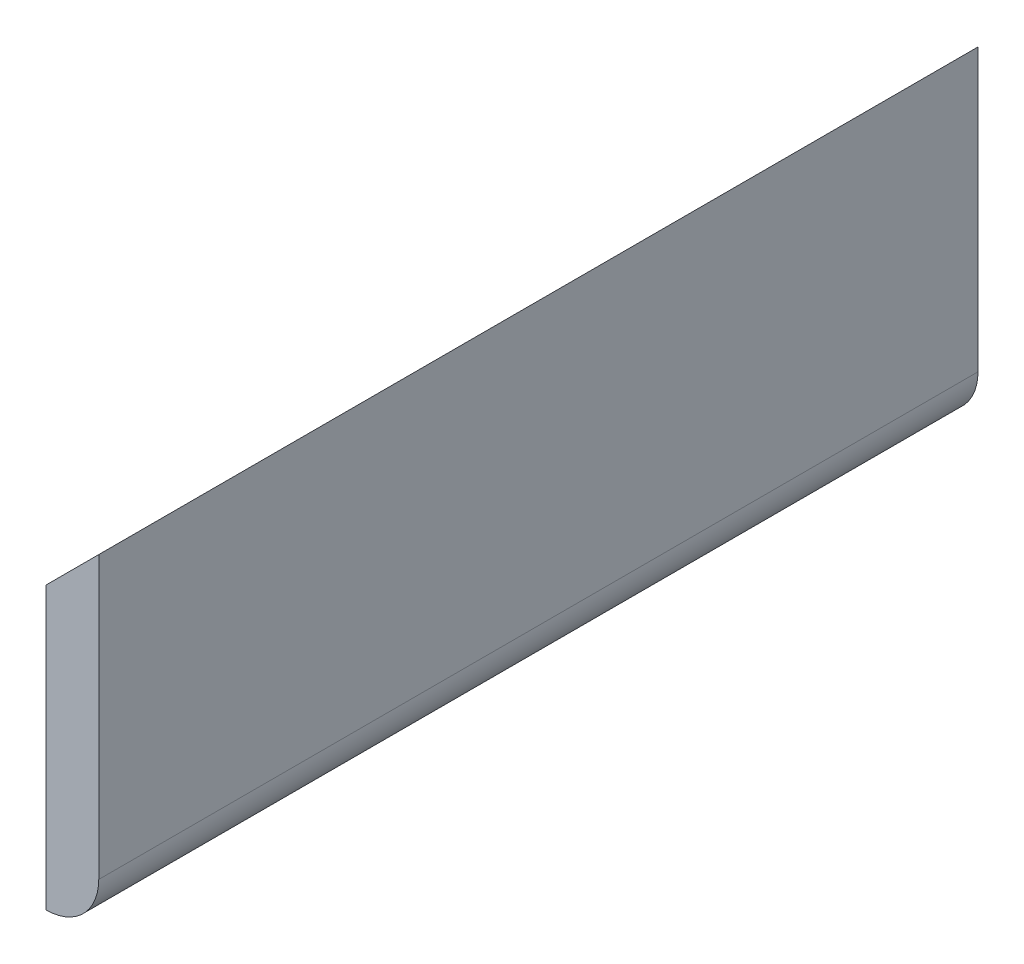
ISO-10303-21;
HEADER;
FILE_DESCRIPTION(('STEP AP214'),'2;1');
FILE_NAME('part.step','',(''),(''),'','','');
FILE_SCHEMA(('AUTOMOTIVE_DESIGN { 1 0 10303 214 1 1 1 1 }'));
ENDSEC;
DATA;
#1=APPLICATION_CONTEXT('core data for automotive mechanical design processes');
#2=APPLICATION_PROTOCOL_DEFINITION('international standard','automotive_design',2000,#1);
#3=PRODUCT_CONTEXT('',#1,'mechanical');
#4=PRODUCT('Part','Part','',(#3));
#5=PRODUCT_RELATED_PRODUCT_CATEGORY('part','',(#4));
#6=PRODUCT_DEFINITION_FORMATION('','',#4);
#7=PRODUCT_DEFINITION_CONTEXT('part definition',#1,'design');
#8=PRODUCT_DEFINITION('design','',#6,#7);
#9=PRODUCT_DEFINITION_SHAPE('','',#8);
#10=(LENGTH_UNIT() NAMED_UNIT(*) SI_UNIT(.MILLI.,.METRE.));
#11=(NAMED_UNIT(*) PLANE_ANGLE_UNIT() SI_UNIT($,.RADIAN.));
#12=(NAMED_UNIT(*) SI_UNIT($,.STERADIAN.) SOLID_ANGLE_UNIT());
#13=UNCERTAINTY_MEASURE_WITH_UNIT(LENGTH_MEASURE(1.E-05),#10,'distance_accuracy_value','');
#14=(GEOMETRIC_REPRESENTATION_CONTEXT(3) GLOBAL_UNCERTAINTY_ASSIGNED_CONTEXT((#13)) GLOBAL_UNIT_ASSIGNED_CONTEXT((#10,
#11,#12)) REPRESENTATION_CONTEXT('',''));
#15=CARTESIAN_POINT('',(0.,0.,0.));
#16=DIRECTION('',(0.,0.,1.));
#17=DIRECTION('',(1.,0.,0.));
#18=AXIS2_PLACEMENT_3D('',#15,#16,#17);
#19=CARTESIAN_POINT('',(2.5,-0.5,85.));
#20=DIRECTION('',(0.,0.,-1.));
#21=DIRECTION('',(-1.,0.,0.));
#22=AXIS2_PLACEMENT_3D('',#19,#20,#21);
#23=CYLINDRICAL_SURFACE('',#22,5.);
#24=CARTESIAN_POINT('',(2.5,-0.5,0.));
#25=DIRECTION('',(0.,0.,1.));
#26=DIRECTION('',(1.,0.,0.));
#27=AXIS2_PLACEMENT_3D('',#24,#25,#26);
#28=CIRCLE('',#27,5.);
#29=CARTESIAN_POINT('',(2.49999999999996,-5.5,0.));
#30=VERTEX_POINT('',#29);
#31=CARTESIAN_POINT('',(7.5,-0.499999999999965,0.));
#32=VERTEX_POINT('',#31);
#33=EDGE_CURVE('E362',#30,#32,#28,.T.);
#34=ORIENTED_EDGE('',*,*,#33,.T.);
#35=DIRECTION('',(0.,0.,-1.));
#36=VECTOR('',#35,1.);
#37=CARTESIAN_POINT('',(7.5,-0.499999999999965,85.));
#38=LINE('',#37,#36);
#39=CARTESIAN_POINT('',(7.5,-0.499999999999965,85.));
#40=VERTEX_POINT('',#39);
#41=EDGE_CURVE('E399',#40,#32,#38,.T.);
#42=ORIENTED_EDGE('',*,*,#41,.F.);
#43=CARTESIAN_POINT('',(2.5,-0.5,85.));
#44=DIRECTION('',(0.,0.,1.));
#45=DIRECTION('',(1.,0.,0.));
#46=AXIS2_PLACEMENT_3D('',#43,#44,#45);
#47=CIRCLE('',#46,5.);
#48=CARTESIAN_POINT('',(2.49999999999996,-5.5,85.));
#49=VERTEX_POINT('',#48);
#50=EDGE_CURVE('E363',#49,#40,#47,.T.);
#51=ORIENTED_EDGE('',*,*,#50,.F.);
#52=DIRECTION('',(0.,0.,-1.));
#53=VECTOR('',#52,1.);
#54=CARTESIAN_POINT('',(2.49999999999996,-5.5,85.));
#55=LINE('',#54,#53);
#56=EDGE_CURVE('E378',#49,#30,#55,.T.);
#57=ORIENTED_EDGE('',*,*,#56,.T.);
#58=EDGE_LOOP('',(#34,#42,#51,#57));
#59=FACE_BOUND('',#58,.T.);
#60=ADVANCED_FACE('F41',(#59),#23,.T.);
#61=CARTESIAN_POINT('',(-7.5,19.5,85.));
#62=DIRECTION('',(0.,1.,0.));
#63=DIRECTION('',(0.,0.,1.));
#64=AXIS2_PLACEMENT_3D('',#61,#62,#63);
#65=PLANE('',#64);
#66=DIRECTION('',(0.,0.,1.));
#67=VECTOR('',#66,1.);
#68=CARTESIAN_POINT('',(27.22,19.5,85.));
#69=LINE('',#68,#67);
#70=CARTESIAN_POINT('',(27.22,19.5,-80.5));
#71=VERTEX_POINT('',#70);
#72=CARTESIAN_POINT('',(27.22,19.5,165.5));
#73=VERTEX_POINT('',#72);
#74=EDGE_CURVE('E198',#71,#73,#69,.T.);
#75=ORIENTED_EDGE('',*,*,#74,.F.);
#76=DIRECTION('',(1.,0.,0.));
#77=VECTOR('',#76,1.);
#78=CARTESIAN_POINT('',(27.22,19.5,-80.5));
#79=LINE('',#78,#77);
#80=CARTESIAN_POINT('',(14.22,19.5,-80.5));
#81=VERTEX_POINT('',#80);
#82=EDGE_CURVE('E201',#81,#71,#79,.T.);
#83=ORIENTED_EDGE('',*,*,#82,.F.);
#84=DIRECTION('',(0.,0.,-1.));
#85=VECTOR('',#84,1.);
#86=CARTESIAN_POINT('',(14.22,19.5,0.));
#87=LINE('',#86,#85);
#88=CARTESIAN_POINT('',(14.22,19.5,0.));
#89=VERTEX_POINT('',#88);
#90=EDGE_CURVE('E241',#89,#81,#87,.T.);
#91=ORIENTED_EDGE('',*,*,#90,.F.);
#92=DIRECTION('',(1.,0.,0.));
#93=VECTOR('',#92,1.);
#94=CARTESIAN_POINT('',(-7.5,19.5,0.));
#95=LINE('',#94,#93);
#96=CARTESIAN_POINT('',(-7.5,19.5,0.));
#97=VERTEX_POINT('',#96);
#98=EDGE_CURVE('E381',#97,#89,#95,.T.);
#99=ORIENTED_EDGE('',*,*,#98,.F.);
#100=DIRECTION('',(0.,0.,-1.));
#101=VECTOR('',#100,1.);
#102=CARTESIAN_POINT('',(-7.5,19.5,85.));
#103=LINE('',#102,#101);
#104=CARTESIAN_POINT('',(-7.5,19.5,85.));
#105=VERTEX_POINT('',#104);
#106=EDGE_CURVE('E397',#105,#97,#103,.T.);
#107=ORIENTED_EDGE('',*,*,#106,.F.);
#108=DIRECTION('',(1.,0.,0.));
#109=VECTOR('',#108,1.);
#110=CARTESIAN_POINT('',(-7.5,19.5,85.));
#111=LINE('',#110,#109);
#112=CARTESIAN_POINT('',(14.22,19.5,85.));
#113=VERTEX_POINT('',#112);
#114=EDGE_CURVE('E366',#105,#113,#111,.T.);
#115=ORIENTED_EDGE('',*,*,#114,.T.);
#116=DIRECTION('',(0.,0.,-1.));
#117=VECTOR('',#116,1.);
#118=CARTESIAN_POINT('',(14.22,19.5,85.));
#119=LINE('',#118,#117);
#120=CARTESIAN_POINT('',(14.22,19.5,165.5));
#121=VERTEX_POINT('',#120);
#122=EDGE_CURVE('E231',#121,#113,#119,.T.);
#123=ORIENTED_EDGE('',*,*,#122,.F.);
#124=DIRECTION('',(-1.,0.,0.));
#125=VECTOR('',#124,1.);
#126=CARTESIAN_POINT('',(27.22,19.5,165.5));
#127=LINE('',#126,#125);
#128=EDGE_CURVE('E204',#73,#121,#127,.T.);
#129=ORIENTED_EDGE('',*,*,#128,.F.);
#130=EDGE_LOOP('',(#75,#83,#91,#99,#107,#115,#123,#129));
#131=FACE_BOUND('',#130,.T.);
#132=ADVANCED_FACE('F200',(#131),#65,.T.);
#133=CARTESIAN_POINT('',(-7.5,-0.499999999999964,85.));
#134=DIRECTION('',(-1.,0.,0.));
#135=DIRECTION('',(0.,-1.,0.));
#136=AXIS2_PLACEMENT_3D('',#133,#134,#135);
#137=PLANE('',#136);
#138=DIRECTION('',(0.,1.,0.));
#139=VECTOR('',#138,1.);
#140=CARTESIAN_POINT('',(-7.5,-0.499999999999964,0.));
#141=LINE('',#140,#139);
#142=CARTESIAN_POINT('',(-7.5,-0.499999999999964,0.));
#143=VERTEX_POINT('',#142);
#144=EDGE_CURVE('E384',#143,#97,#141,.T.);
#145=ORIENTED_EDGE('',*,*,#144,.F.);
#146=DIRECTION('',(0.,0.,-1.));
#147=VECTOR('',#146,1.);
#148=CARTESIAN_POINT('',(-7.5,-0.499999999999964,85.));
#149=LINE('',#148,#147);
#150=CARTESIAN_POINT('',(-7.5,-0.499999999999964,85.));
#151=VERTEX_POINT('',#150);
#152=EDGE_CURVE('E395',#151,#143,#149,.T.);
#153=ORIENTED_EDGE('',*,*,#152,.F.);
#154=DIRECTION('',(0.,1.,0.));
#155=VECTOR('',#154,1.);
#156=CARTESIAN_POINT('',(-7.5,-0.499999999999964,85.));
#157=LINE('',#156,#155);
#158=EDGE_CURVE('E370',#151,#105,#157,.T.);
#159=ORIENTED_EDGE('',*,*,#158,.T.);
#160=ORIENTED_EDGE('',*,*,#106,.T.);
#161=EDGE_LOOP('',(#145,#153,#159,#160));
#162=FACE_BOUND('',#161,.T.);
#163=ADVANCED_FACE('F435',(#162),#137,.T.);
#164=CARTESIAN_POINT('',(-2.5,-0.5,85.));
#165=DIRECTION('',(0.,0.,-1.));
#166=DIRECTION('',(-1.,0.,0.));
#167=AXIS2_PLACEMENT_3D('',#164,#165,#166);
#168=CYLINDRICAL_SURFACE('',#167,5.);
#169=CARTESIAN_POINT('',(-2.5,-0.5,0.));
#170=DIRECTION('',(0.,0.,-1.));
#171=DIRECTION('',(-1.,0.,0.));
#172=AXIS2_PLACEMENT_3D('',#169,#170,#171);
#173=CIRCLE('',#172,5.);
#174=CARTESIAN_POINT('',(-2.49999999999996,-5.5,0.));
#175=VERTEX_POINT('',#174);
#176=EDGE_CURVE('E387',#175,#143,#173,.T.);
#177=ORIENTED_EDGE('',*,*,#176,.F.);
#178=DIRECTION('',(0.,0.,-1.));
#179=VECTOR('',#178,1.);
#180=CARTESIAN_POINT('',(-2.49999999999996,-5.5,85.));
#181=LINE('',#180,#179);
#182=CARTESIAN_POINT('',(-2.49999999999996,-5.5,85.));
#183=VERTEX_POINT('',#182);
#184=EDGE_CURVE('E393',#183,#175,#181,.T.);
#185=ORIENTED_EDGE('',*,*,#184,.F.);
#186=CARTESIAN_POINT('',(-2.5,-0.5,85.));
#187=DIRECTION('',(0.,0.,-1.));
#188=DIRECTION('',(-1.,0.,0.));
#189=AXIS2_PLACEMENT_3D('',#186,#187,#188);
#190=CIRCLE('',#189,5.);
#191=EDGE_CURVE('E373',#183,#151,#190,.T.);
#192=ORIENTED_EDGE('',*,*,#191,.T.);
#193=ORIENTED_EDGE('',*,*,#152,.T.);
#194=EDGE_LOOP('',(#177,#185,#192,#193));
#195=FACE_BOUND('',#194,.T.);
#196=ADVANCED_FACE('F438',(#195),#168,.T.);
#197=CARTESIAN_POINT('',(-2.49999999999996,-5.5,85.));
#198=DIRECTION('',(0.,1.,0.));
#199=DIRECTION('',(0.,0.,1.));
#200=AXIS2_PLACEMENT_3D('',#197,#198,#199);
#201=PLANE('',#200);
#202=DIRECTION('',(1.,0.,0.));
#203=VECTOR('',#202,1.);
#204=CARTESIAN_POINT('',(-2.49999999999996,-5.5,0.));
#205=LINE('',#204,#203);
#206=EDGE_CURVE('E367',#175,#30,#205,.T.);
#207=ORIENTED_EDGE('',*,*,#206,.T.);
#208=ORIENTED_EDGE('',*,*,#56,.F.);
#209=DIRECTION('',(1.,0.,0.));
#210=VECTOR('',#209,1.);
#211=CARTESIAN_POINT('',(-2.49999999999996,-5.5,85.));
#212=LINE('',#211,#210);
#213=EDGE_CURVE('E376',#183,#49,#212,.T.);
#214=ORIENTED_EDGE('',*,*,#213,.F.);
#215=ORIENTED_EDGE('',*,*,#184,.T.);
#216=EDGE_LOOP('',(#207,#208,#214,#215));
#217=FACE_BOUND('',#216,.T.);
#218=ADVANCED_FACE('F442',(#217),#201,.F.);
#219=CARTESIAN_POINT('',(2.5,-0.5,85.));
#220=DIRECTION('',(0.,0.,1.));
#221=DIRECTION('',(1.,0.,0.));
#222=AXIS2_PLACEMENT_3D('',#219,#220,#221);
#223=PLANE('',#222);
#224=DIRECTION('',(0.,1.,0.));
#225=VECTOR('',#224,1.);
#226=CARTESIAN_POINT('',(14.22,-0.499999999999997,85.));
#227=LINE('',#226,#225);
#228=CARTESIAN_POINT('',(14.22,-0.499999999999966,85.));
#229=VERTEX_POINT('',#228);
#230=EDGE_CURVE('E210',#229,#113,#227,.T.);
#231=ORIENTED_EDGE('',*,*,#230,.T.);
#232=ORIENTED_EDGE('',*,*,#114,.F.);
#233=ORIENTED_EDGE('',*,*,#158,.F.);
#234=ORIENTED_EDGE('',*,*,#191,.F.);
#235=ORIENTED_EDGE('',*,*,#213,.T.);
#236=ORIENTED_EDGE('',*,*,#50,.T.);
#237=DIRECTION('',(-1.,0.,0.));
#238=VECTOR('',#237,1.);
#239=CARTESIAN_POINT('',(29.22,-0.499999999999968,85.));
#240=LINE('',#239,#238);
#241=EDGE_CURVE('E209',#229,#40,#240,.T.);
#242=ORIENTED_EDGE('',*,*,#241,.F.);
#243=EDGE_LOOP('',(#231,#232,#233,#234,#235,#236,#242));
#244=FACE_BOUND('',#243,.T.);
#245=CARTESIAN_POINT('',(0.,0.,85.));
#246=DIRECTION('',(0.,0.,1.));
#247=DIRECTION('',(1.,0.,0.));
#248=AXIS2_PLACEMENT_3D('',#245,#246,#247);
#249=CIRCLE('',#248,4.);
#250=CARTESIAN_POINT('',(-1.,3.87298334620742,85.));
#251=VERTEX_POINT('',#250);
#252=CARTESIAN_POINT('',(1.,3.87298334620742,85.));
#253=VERTEX_POINT('',#252);
#254=EDGE_CURVE('E291',#251,#253,#249,.T.);
#255=ORIENTED_EDGE('',*,*,#254,.F.);
#256=DIRECTION('',(0.,-1.,0.));
#257=VECTOR('',#256,1.);
#258=CARTESIAN_POINT('',(-1.,3.87298334620742,85.));
#259=LINE('',#258,#257);
#260=CARTESIAN_POINT('',(-1.,16.,85.));
#261=VERTEX_POINT('',#260);
#262=EDGE_CURVE('E309',#261,#251,#259,.T.);
#263=ORIENTED_EDGE('',*,*,#262,.F.);
#264=DIRECTION('',(-1.,0.,0.));
#265=VECTOR('',#264,1.);
#266=CARTESIAN_POINT('',(-1.,16.,85.));
#267=LINE('',#266,#265);
#268=CARTESIAN_POINT('',(1.,16.,85.));
#269=VERTEX_POINT('',#268);
#270=EDGE_CURVE('E312',#269,#261,#267,.T.);
#271=ORIENTED_EDGE('',*,*,#270,.F.);
#272=DIRECTION('',(0.,1.,0.));
#273=VECTOR('',#272,1.);
#274=CARTESIAN_POINT('',(1.,3.87298334620742,85.));
#275=LINE('',#274,#273);
#276=EDGE_CURVE('E298',#253,#269,#275,.T.);
#277=ORIENTED_EDGE('',*,*,#276,.F.);
#278=EDGE_LOOP('',(#255,#263,#271,#277));
#279=FACE_BOUND('',#278,.T.);
#280=ADVANCED_FACE('F415',(#244,#279),#223,.T.);
#281=CARTESIAN_POINT('',(0.,0.,0.));
#282=DIRECTION('',(0.,0.,1.));
#283=DIRECTION('',(1.,0.,0.));
#284=AXIS2_PLACEMENT_3D('',#281,#282,#283);
#285=PLANE('',#284);
#286=CARTESIAN_POINT('',(0.,0.,0.));
#287=DIRECTION('',(0.,0.,1.));
#288=DIRECTION('',(1.,0.,0.));
#289=AXIS2_PLACEMENT_3D('',#286,#287,#288);
#290=CIRCLE('',#289,4.);
#291=CARTESIAN_POINT('',(-1.,3.87298334620742,0.));
#292=VERTEX_POINT('',#291);
#293=CARTESIAN_POINT('',(1.,3.87298334620742,0.));
#294=VERTEX_POINT('',#293);
#295=EDGE_CURVE('E329',#292,#294,#290,.T.);
#296=ORIENTED_EDGE('',*,*,#295,.T.);
#297=DIRECTION('',(0.,1.,0.));
#298=VECTOR('',#297,1.);
#299=CARTESIAN_POINT('',(1.,3.87298334620742,0.));
#300=LINE('',#299,#298);
#301=CARTESIAN_POINT('',(1.,16.,0.));
#302=VERTEX_POINT('',#301);
#303=EDGE_CURVE('E345',#294,#302,#300,.T.);
#304=ORIENTED_EDGE('',*,*,#303,.T.);
#305=DIRECTION('',(-1.,0.,0.));
#306=VECTOR('',#305,1.);
#307=CARTESIAN_POINT('',(-1.,16.,0.));
#308=LINE('',#307,#306);
#309=CARTESIAN_POINT('',(-1.,16.,0.));
#310=VERTEX_POINT('',#309);
#311=EDGE_CURVE('E348',#302,#310,#308,.T.);
#312=ORIENTED_EDGE('',*,*,#311,.T.);
#313=DIRECTION('',(0.,-1.,0.));
#314=VECTOR('',#313,1.);
#315=CARTESIAN_POINT('',(-1.,3.87298334620742,0.));
#316=LINE('',#315,#314);
#317=EDGE_CURVE('E336',#310,#292,#316,.T.);
#318=ORIENTED_EDGE('',*,*,#317,.T.);
#319=EDGE_LOOP('',(#296,#304,#312,#318));
#320=FACE_BOUND('',#319,.T.);
#321=ORIENTED_EDGE('',*,*,#98,.T.);
#322=DIRECTION('',(0.,1.,0.));
#323=VECTOR('',#322,1.);
#324=CARTESIAN_POINT('',(14.22,-0.499999999999997,0.));
#325=LINE('',#324,#323);
#326=CARTESIAN_POINT('',(14.22,-0.499999999999997,0.));
#327=VERTEX_POINT('',#326);
#328=EDGE_CURVE('E276',#327,#89,#325,.T.);
#329=ORIENTED_EDGE('',*,*,#328,.F.);
#330=DIRECTION('',(-1.,0.,0.));
#331=VECTOR('',#330,1.);
#332=CARTESIAN_POINT('',(29.22,-0.499999999999968,0.));
#333=LINE('',#332,#331);
#334=EDGE_CURVE('E285',#327,#32,#333,.T.);
#335=ORIENTED_EDGE('',*,*,#334,.T.);
#336=ORIENTED_EDGE('',*,*,#33,.F.);
#337=ORIENTED_EDGE('',*,*,#206,.F.);
#338=ORIENTED_EDGE('',*,*,#176,.T.);
#339=ORIENTED_EDGE('',*,*,#144,.T.);
#340=EDGE_LOOP('',(#321,#329,#335,#336,#337,#338,#339));
#341=FACE_BOUND('',#340,.T.);
#342=ADVANCED_FACE('F428',(#320,#341),#285,.F.);
#343=CARTESIAN_POINT('',(0.,0.,5.));
#344=DIRECTION('',(0.,0.,1.));
#345=DIRECTION('',(1.,0.,0.));
#346=AXIS2_PLACEMENT_3D('',#343,#344,#345);
#347=PLANE('',#346);
#348=CARTESIAN_POINT('',(0.,0.,5.));
#349=DIRECTION('',(0.,0.,1.));
#350=DIRECTION('',(1.,0.,0.));
#351=AXIS2_PLACEMENT_3D('',#348,#349,#350);
#352=CIRCLE('',#351,4.);
#353=CARTESIAN_POINT('',(-1.,3.87298334620742,5.));
#354=VERTEX_POINT('',#353);
#355=CARTESIAN_POINT('',(1.,3.87298334620742,5.));
#356=VERTEX_POINT('',#355);
#357=EDGE_CURVE('E332',#354,#356,#352,.T.);
#358=ORIENTED_EDGE('',*,*,#357,.F.);
#359=DIRECTION('',(0.,-1.,0.));
#360=VECTOR('',#359,1.);
#361=CARTESIAN_POINT('',(-1.,3.87298334620742,5.));
#362=LINE('',#361,#360);
#363=CARTESIAN_POINT('',(-1.,16.,5.));
#364=VERTEX_POINT('',#363);
#365=EDGE_CURVE('E340',#364,#354,#362,.T.);
#366=ORIENTED_EDGE('',*,*,#365,.F.);
#367=DIRECTION('',(-1.,0.,0.));
#368=VECTOR('',#367,1.);
#369=CARTESIAN_POINT('',(-1.,16.,5.));
#370=LINE('',#369,#368);
#371=CARTESIAN_POINT('',(1.,16.,5.));
#372=VERTEX_POINT('',#371);
#373=EDGE_CURVE('E338',#372,#364,#370,.T.);
#374=ORIENTED_EDGE('',*,*,#373,.F.);
#375=DIRECTION('',(0.,1.,0.));
#376=VECTOR('',#375,1.);
#377=CARTESIAN_POINT('',(1.,3.87298334620742,5.));
#378=LINE('',#377,#376);
#379=EDGE_CURVE('E335',#356,#372,#378,.T.);
#380=ORIENTED_EDGE('',*,*,#379,.F.);
#381=EDGE_LOOP('',(#358,#366,#374,#380));
#382=FACE_BOUND('',#381,.T.);
#383=CARTESIAN_POINT('',(0.,0.,5.));
#384=DIRECTION('',(0.,0.,1.));
#385=DIRECTION('',(1.,0.,0.));
#386=AXIS2_PLACEMENT_3D('',#383,#384,#385);
#387=CIRCLE('',#386,2.25);
#388=CARTESIAN_POINT('',(2.25,0.,5.));
#389=VERTEX_POINT('',#388);
#390=EDGE_CURVE('E326',#389,#389,#387,.T.);
#391=ORIENTED_EDGE('',*,*,#390,.T.);
#392=EDGE_LOOP('',(#391));
#393=FACE_BOUND('',#392,.T.);
#394=ADVANCED_FACE('F456',(#382,#393),#347,.F.);
#395=CARTESIAN_POINT('',(0.,0.,5.));
#396=DIRECTION('',(0.,0.,-1.));
#397=DIRECTION('',(-1.,0.,0.));
#398=AXIS2_PLACEMENT_3D('',#395,#396,#397);
#399=CYLINDRICAL_SURFACE('',#398,4.);
#400=ORIENTED_EDGE('',*,*,#295,.F.);
#401=DIRECTION('',(0.,0.,-1.));
#402=VECTOR('',#401,1.);
#403=CARTESIAN_POINT('',(-1.,3.87298334620742,5.));
#404=LINE('',#403,#402);
#405=EDGE_CURVE('E342',#354,#292,#404,.T.);
#406=ORIENTED_EDGE('',*,*,#405,.F.);
#407=ORIENTED_EDGE('',*,*,#357,.T.);
#408=DIRECTION('',(0.,0.,-1.));
#409=VECTOR('',#408,1.);
#410=CARTESIAN_POINT('',(1.,3.87298334620742,5.));
#411=LINE('',#410,#409);
#412=EDGE_CURVE('E359',#356,#294,#411,.T.);
#413=ORIENTED_EDGE('',*,*,#412,.T.);
#414=EDGE_LOOP('',(#400,#406,#407,#413));
#415=FACE_BOUND('',#414,.T.);
#416=ADVANCED_FACE('F511',(#415),#399,.F.);
#417=CARTESIAN_POINT('',(1.,3.87298334620742,5.));
#418=DIRECTION('',(-1.,0.,0.));
#419=DIRECTION('',(0.,-1.,0.));
#420=AXIS2_PLACEMENT_3D('',#417,#418,#419);
#421=PLANE('',#420);
#422=ORIENTED_EDGE('',*,*,#303,.F.);
#423=ORIENTED_EDGE('',*,*,#412,.F.);
#424=ORIENTED_EDGE('',*,*,#379,.T.);
#425=DIRECTION('',(0.,0.,-1.));
#426=VECTOR('',#425,1.);
#427=CARTESIAN_POINT('',(1.,16.,5.));
#428=LINE('',#427,#426);
#429=EDGE_CURVE('E357',#372,#302,#428,.T.);
#430=ORIENTED_EDGE('',*,*,#429,.T.);
#431=EDGE_LOOP('',(#422,#423,#424,#430));
#432=FACE_BOUND('',#431,.T.);
#433=ADVANCED_FACE('F519',(#432),#421,.T.);
#434=CARTESIAN_POINT('',(-1.,16.,5.));
#435=DIRECTION('',(0.,-1.,0.));
#436=DIRECTION('',(0.,0.,-1.));
#437=AXIS2_PLACEMENT_3D('',#434,#435,#436);
#438=PLANE('',#437);
#439=ORIENTED_EDGE('',*,*,#311,.F.);
#440=ORIENTED_EDGE('',*,*,#429,.F.);
#441=ORIENTED_EDGE('',*,*,#373,.T.);
#442=DIRECTION('',(0.,0.,-1.));
#443=VECTOR('',#442,1.);
#444=CARTESIAN_POINT('',(-1.,16.,5.));
#445=LINE('',#444,#443);
#446=EDGE_CURVE('E355',#364,#310,#445,.T.);
#447=ORIENTED_EDGE('',*,*,#446,.T.);
#448=EDGE_LOOP('',(#439,#440,#441,#447));
#449=FACE_BOUND('',#448,.T.);
#450=ADVANCED_FACE('F515',(#449),#438,.T.);
#451=CARTESIAN_POINT('',(-1.,3.87298334620742,5.));
#452=DIRECTION('',(1.,0.,0.));
#453=DIRECTION('',(0.,1.,0.));
#454=AXIS2_PLACEMENT_3D('',#451,#452,#453);
#455=PLANE('',#454);
#456=ORIENTED_EDGE('',*,*,#317,.F.);
#457=ORIENTED_EDGE('',*,*,#446,.F.);
#458=ORIENTED_EDGE('',*,*,#365,.T.);
#459=ORIENTED_EDGE('',*,*,#405,.T.);
#460=EDGE_LOOP('',(#456,#457,#458,#459));
#461=FACE_BOUND('',#460,.T.);
#462=ADVANCED_FACE('F507',(#461),#455,.T.);
#463=CARTESIAN_POINT('',(0.,0.,5.));
#464=DIRECTION('',(0.,0.,-1.));
#465=DIRECTION('',(-1.,0.,0.));
#466=AXIS2_PLACEMENT_3D('',#463,#464,#465);
#467=CYLINDRICAL_SURFACE('',#466,2.25);
#468=ORIENTED_EDGE('',*,*,#390,.F.);
#469=EDGE_LOOP('',(#468));
#470=FACE_BOUND('',#469,.T.);
#471=CARTESIAN_POINT('',(0.,0.,0.));
#472=DIRECTION('',(0.,0.,1.));
#473=DIRECTION('',(1.,0.,0.));
#474=AXIS2_PLACEMENT_3D('',#471,#472,#473);
#475=CIRCLE('',#474,2.25);
#476=CARTESIAN_POINT('',(2.25,0.,0.));
#477=VERTEX_POINT('',#476);
#478=EDGE_CURVE('E325',#477,#477,#475,.T.);
#479=ORIENTED_EDGE('',*,*,#478,.T.);
#480=EDGE_LOOP('',(#479));
#481=FACE_BOUND('',#480,.T.);
#482=ADVANCED_FACE('F504',(#470,#481),#467,.T.);
#483=ORIENTED_EDGE('',*,*,#478,.F.);
#484=EDGE_LOOP('',(#483));
#485=FACE_BOUND('',#484,.T.);
#486=ADVANCED_FACE('F458',(#485),#285,.F.);
#487=CARTESIAN_POINT('',(0.,0.,80.));
#488=DIRECTION('',(0.,0.,1.));
#489=DIRECTION('',(1.,0.,0.));
#490=AXIS2_PLACEMENT_3D('',#487,#488,#489);
#491=CYLINDRICAL_SURFACE('',#490,4.);
#492=ORIENTED_EDGE('',*,*,#254,.T.);
#493=DIRECTION('',(0.,0.,1.));
#494=VECTOR('',#493,1.);
#495=CARTESIAN_POINT('',(1.,3.87298334620742,80.));
#496=LINE('',#495,#494);
#497=CARTESIAN_POINT('',(1.,3.87298334620742,80.));
#498=VERTEX_POINT('',#497);
#499=EDGE_CURVE('E307',#498,#253,#496,.T.);
#500=ORIENTED_EDGE('',*,*,#499,.F.);
#501=CARTESIAN_POINT('',(0.,0.,80.));
#502=DIRECTION('',(0.,0.,1.));
#503=DIRECTION('',(1.,0.,0.));
#504=AXIS2_PLACEMENT_3D('',#501,#502,#503);
#505=CIRCLE('',#504,4.);
#506=CARTESIAN_POINT('',(-1.,3.87298334620742,80.));
#507=VERTEX_POINT('',#506);
#508=EDGE_CURVE('E294',#507,#498,#505,.T.);
#509=ORIENTED_EDGE('',*,*,#508,.F.);
#510=DIRECTION('',(0.,0.,1.));
#511=VECTOR('',#510,1.);
#512=CARTESIAN_POINT('',(-1.,3.87298334620742,80.));
#513=LINE('',#512,#511);
#514=EDGE_CURVE('E323',#507,#251,#513,.T.);
#515=ORIENTED_EDGE('',*,*,#514,.T.);
#516=EDGE_LOOP('',(#492,#500,#509,#515));
#517=FACE_BOUND('',#516,.T.);
#518=ADVANCED_FACE('F499',(#517),#491,.F.);
#519=CARTESIAN_POINT('',(-1.,3.87298334620742,80.));
#520=DIRECTION('',(-1.,0.,0.));
#521=DIRECTION('',(0.,-1.,0.));
#522=AXIS2_PLACEMENT_3D('',#519,#520,#521);
#523=PLANE('',#522);
#524=ORIENTED_EDGE('',*,*,#262,.T.);
#525=ORIENTED_EDGE('',*,*,#514,.F.);
#526=DIRECTION('',(0.,-1.,0.));
#527=VECTOR('',#526,1.);
#528=CARTESIAN_POINT('',(-1.,3.87298334620742,80.));
#529=LINE('',#528,#527);
#530=CARTESIAN_POINT('',(-1.,16.,80.));
#531=VERTEX_POINT('',#530);
#532=EDGE_CURVE('E297',#531,#507,#529,.T.);
#533=ORIENTED_EDGE('',*,*,#532,.F.);
#534=DIRECTION('',(0.,0.,1.));
#535=VECTOR('',#534,1.);
#536=CARTESIAN_POINT('',(-1.,16.,80.));
#537=LINE('',#536,#535);
#538=EDGE_CURVE('E321',#531,#261,#537,.T.);
#539=ORIENTED_EDGE('',*,*,#538,.T.);
#540=EDGE_LOOP('',(#524,#525,#533,#539));
#541=FACE_BOUND('',#540,.T.);
#542=ADVANCED_FACE('F495',(#541),#523,.F.);
#543=CARTESIAN_POINT('',(-1.,16.,80.));
#544=DIRECTION('',(0.,1.,0.));
#545=DIRECTION('',(0.,0.,1.));
#546=AXIS2_PLACEMENT_3D('',#543,#544,#545);
#547=PLANE('',#546);
#548=ORIENTED_EDGE('',*,*,#270,.T.);
#549=ORIENTED_EDGE('',*,*,#538,.F.);
#550=DIRECTION('',(-1.,0.,0.));
#551=VECTOR('',#550,1.);
#552=CARTESIAN_POINT('',(-1.,16.,80.));
#553=LINE('',#552,#551);
#554=CARTESIAN_POINT('',(1.,16.,80.));
#555=VERTEX_POINT('',#554);
#556=EDGE_CURVE('E301',#555,#531,#553,.T.);
#557=ORIENTED_EDGE('',*,*,#556,.F.);
#558=DIRECTION('',(0.,0.,1.));
#559=VECTOR('',#558,1.);
#560=CARTESIAN_POINT('',(1.,16.,80.));
#561=LINE('',#560,#559);
#562=EDGE_CURVE('E319',#555,#269,#561,.T.);
#563=ORIENTED_EDGE('',*,*,#562,.T.);
#564=EDGE_LOOP('',(#548,#549,#557,#563));
#565=FACE_BOUND('',#564,.T.);
#566=ADVANCED_FACE('F491',(#565),#547,.F.);
#567=CARTESIAN_POINT('',(1.,3.87298334620742,80.));
#568=DIRECTION('',(1.,0.,0.));
#569=DIRECTION('',(0.,1.,0.));
#570=AXIS2_PLACEMENT_3D('',#567,#568,#569);
#571=PLANE('',#570);
#572=ORIENTED_EDGE('',*,*,#276,.T.);
#573=ORIENTED_EDGE('',*,*,#562,.F.);
#574=DIRECTION('',(0.,1.,0.));
#575=VECTOR('',#574,1.);
#576=CARTESIAN_POINT('',(1.,3.87298334620742,80.));
#577=LINE('',#576,#575);
#578=EDGE_CURVE('E304',#498,#555,#577,.T.);
#579=ORIENTED_EDGE('',*,*,#578,.F.);
#580=ORIENTED_EDGE('',*,*,#499,.T.);
#581=EDGE_LOOP('',(#572,#573,#579,#580));
#582=FACE_BOUND('',#581,.T.);
#583=ADVANCED_FACE('F487',(#582),#571,.F.);
#584=CARTESIAN_POINT('',(0.,0.,80.));
#585=DIRECTION('',(0.,0.,-1.));
#586=DIRECTION('',(1.,0.,0.));
#587=AXIS2_PLACEMENT_3D('',#584,#585,#586);
#588=PLANE('',#587);
#589=CARTESIAN_POINT('',(0.,0.,80.));
#590=DIRECTION('',(0.,0.,1.));
#591=DIRECTION('',(1.,0.,0.));
#592=AXIS2_PLACEMENT_3D('',#589,#590,#591);
#593=CIRCLE('',#592,2.25);
#594=CARTESIAN_POINT('',(2.25,0.,80.));
#595=VERTEX_POINT('',#594);
#596=EDGE_CURVE('E288',#595,#595,#593,.T.);
#597=ORIENTED_EDGE('',*,*,#596,.F.);
#598=EDGE_LOOP('',(#597));
#599=FACE_BOUND('',#598,.T.);
#600=ORIENTED_EDGE('',*,*,#508,.T.);
#601=ORIENTED_EDGE('',*,*,#578,.T.);
#602=ORIENTED_EDGE('',*,*,#556,.T.);
#603=ORIENTED_EDGE('',*,*,#532,.T.);
#604=EDGE_LOOP('',(#600,#601,#602,#603));
#605=FACE_BOUND('',#604,.T.);
#606=ADVANCED_FACE('F483',(#599,#605),#588,.F.);
#607=CARTESIAN_POINT('',(0.,0.,80.));
#608=DIRECTION('',(0.,0.,1.));
#609=DIRECTION('',(1.,0.,0.));
#610=AXIS2_PLACEMENT_3D('',#607,#608,#609);
#611=CYLINDRICAL_SURFACE('',#610,2.25);
#612=ORIENTED_EDGE('',*,*,#596,.T.);
#613=EDGE_LOOP('',(#612));
#614=FACE_BOUND('',#613,.T.);
#615=CARTESIAN_POINT('',(0.,0.,85.));
#616=DIRECTION('',(0.,0.,1.));
#617=DIRECTION('',(1.,0.,0.));
#618=AXIS2_PLACEMENT_3D('',#615,#616,#617);
#619=CIRCLE('',#618,2.25);
#620=CARTESIAN_POINT('',(2.25,0.,85.));
#621=VERTEX_POINT('',#620);
#622=EDGE_CURVE('E287',#621,#621,#619,.T.);
#623=ORIENTED_EDGE('',*,*,#622,.F.);
#624=EDGE_LOOP('',(#623));
#625=FACE_BOUND('',#624,.T.);
#626=ADVANCED_FACE('F480',(#614,#625),#611,.T.);
#627=ORIENTED_EDGE('',*,*,#622,.T.);
#628=EDGE_LOOP('',(#627));
#629=FACE_BOUND('',#628,.T.);
#630=ADVANCED_FACE('F479',(#629),#223,.T.);
#631=CARTESIAN_POINT('',(29.22,-0.499999999999968,85.));
#632=DIRECTION('',(0.,1.,0.));
#633=DIRECTION('',(-1.,0.,0.));
#634=AXIS2_PLACEMENT_3D('',#631,#632,#633);
#635=PLANE('',#634);
#636=ORIENTED_EDGE('',*,*,#334,.F.);
#637=DIRECTION('',(0.,0.,-1.));
#638=VECTOR('',#637,1.);
#639=CARTESIAN_POINT('',(14.22,-0.499999999999966,167.5));
#640=LINE('',#639,#638);
#641=EDGE_CURVE('E248',#327,#229,#640,.F.);
#642=ORIENTED_EDGE('',*,*,#641,.T.);
#643=ORIENTED_EDGE('',*,*,#241,.T.);
#644=ORIENTED_EDGE('',*,*,#41,.T.);
#645=EDGE_LOOP('',(#636,#642,#643,#644));
#646=FACE_BOUND('',#645,.T.);
#647=ADVANCED_FACE('F407',(#646),#635,.F.);
#648=CARTESIAN_POINT('',(29.22,0.,0.));
#649=DIRECTION('',(1.,0.,0.));
#650=DIRECTION('',(0.,1.,0.));
#651=AXIS2_PLACEMENT_3D('',#648,#649,#650);
#652=PLANE('',#651);
#653=DIRECTION('',(0.,1.,0.));
#654=VECTOR('',#653,1.);
#655=CARTESIAN_POINT('',(29.22,-0.499999999999997,167.5));
#656=LINE('',#655,#654);
#657=CARTESIAN_POINT('',(29.22,14.5,167.5));
#658=VERTEX_POINT('',#657);
#659=CARTESIAN_POINT('',(29.22,94.5,167.5));
#660=VERTEX_POINT('',#659);
#661=EDGE_CURVE('E274',#658,#660,#656,.T.);
#662=ORIENTED_EDGE('',*,*,#661,.F.);
#663=DIRECTION('',(0.,0.,-1.));
#664=VECTOR('',#663,1.);
#665=CARTESIAN_POINT('',(29.22,14.5,-82.5));
#666=LINE('',#665,#664);
#667=CARTESIAN_POINT('',(29.22,14.5,-82.5));
#668=VERTEX_POINT('',#667);
#669=EDGE_CURVE('E273',#658,#668,#666,.T.);
#670=ORIENTED_EDGE('',*,*,#669,.T.);
#671=DIRECTION('',(0.,1.,0.));
#672=VECTOR('',#671,1.);
#673=CARTESIAN_POINT('',(29.22,-0.499999999999997,-82.5));
#674=LINE('',#673,#672);
#675=CARTESIAN_POINT('',(29.22,94.5,-82.5));
#676=VERTEX_POINT('',#675);
#677=EDGE_CURVE('E262',#668,#676,#674,.T.);
#678=ORIENTED_EDGE('',*,*,#677,.T.);
#679=DIRECTION('',(0.,0.,-1.));
#680=VECTOR('',#679,1.);
#681=CARTESIAN_POINT('',(29.22,94.5,167.5));
#682=LINE('',#681,#680);
#683=EDGE_CURVE('E233',#660,#676,#682,.T.);
#684=ORIENTED_EDGE('',*,*,#683,.F.);
#685=EDGE_LOOP('',(#662,#670,#678,#684));
#686=FACE_BOUND('',#685,.T.);
#687=ADVANCED_FACE('F271',(#686),#652,.T.);
#688=CARTESIAN_POINT('',(14.22,-0.499999999999997,85.));
#689=DIRECTION('',(-1.,0.,0.));
#690=DIRECTION('',(0.,0.,1.));
#691=AXIS2_PLACEMENT_3D('',#688,#689,#690);
#692=PLANE('',#691);
#693=DIRECTION('',(0.,1.,0.));
#694=VECTOR('',#693,1.);
#695=CARTESIAN_POINT('',(14.22,-0.499999999999997,167.5));
#696=LINE('',#695,#694);
#697=CARTESIAN_POINT('',(14.22,-0.499999999999997,167.5));
#698=VERTEX_POINT('',#697);
#699=CARTESIAN_POINT('',(14.22,79.4999999999999,167.5));
#700=VERTEX_POINT('',#699);
#701=EDGE_CURVE('E278',#698,#700,#696,.T.);
#702=ORIENTED_EDGE('',*,*,#701,.T.);
#703=DIRECTION('',(0.,0.,-1.));
#704=VECTOR('',#703,1.);
#705=CARTESIAN_POINT('',(14.22,79.4999999999999,165.5));
#706=LINE('',#705,#704);
#707=CARTESIAN_POINT('',(14.22,79.4999999999999,165.5));
#708=VERTEX_POINT('',#707);
#709=EDGE_CURVE('E51',#700,#708,#706,.T.);
#710=ORIENTED_EDGE('',*,*,#709,.T.);
#711=DIRECTION('',(0.,1.,0.));
#712=VECTOR('',#711,1.);
#713=CARTESIAN_POINT('',(14.22,-0.499999999999997,165.5));
#714=LINE('',#713,#712);
#715=EDGE_CURVE('E229',#121,#708,#714,.T.);
#716=ORIENTED_EDGE('',*,*,#715,.F.);
#717=ORIENTED_EDGE('',*,*,#122,.T.);
#718=ORIENTED_EDGE('',*,*,#230,.F.);
#719=DIRECTION('',(0.,0.,1.));
#720=VECTOR('',#719,1.);
#721=CARTESIAN_POINT('',(14.22,-0.499999999999997,85.));
#722=LINE('',#721,#720);
#723=EDGE_CURVE('E236',#229,#698,#722,.T.);
#724=ORIENTED_EDGE('',*,*,#723,.T.);
#725=EDGE_LOOP('',(#702,#710,#716,#717,#718,#724));
#726=FACE_BOUND('',#725,.T.);
#727=ADVANCED_FACE('F421',(#726),#692,.T.);
#728=CARTESIAN_POINT('',(27.22,-0.499999999999997,0.));
#729=DIRECTION('',(-1.,0.,0.));
#730=DIRECTION('',(0.,0.,1.));
#731=AXIS2_PLACEMENT_3D('',#728,#729,#730);
#732=PLANE('',#731);
#733=DIRECTION('',(0.,0.,-1.));
#734=VECTOR('',#733,1.);
#735=CARTESIAN_POINT('',(27.22,92.5,0.));
#736=LINE('',#735,#734);
#737=CARTESIAN_POINT('',(27.22,92.4999999999999,165.5));
#738=VERTEX_POINT('',#737);
#739=CARTESIAN_POINT('',(27.22,92.5,-80.5));
#740=VERTEX_POINT('',#739);
#741=EDGE_CURVE('E222',#738,#740,#736,.T.);
#742=ORIENTED_EDGE('',*,*,#741,.T.);
#743=DIRECTION('',(0.,1.,0.));
#744=VECTOR('',#743,1.);
#745=CARTESIAN_POINT('',(27.22,-229.730816714146,-80.5));
#746=LINE('',#745,#744);
#747=EDGE_CURVE('E215',#71,#740,#746,.T.);
#748=ORIENTED_EDGE('',*,*,#747,.F.);
#749=ORIENTED_EDGE('',*,*,#74,.T.);
#750=DIRECTION('',(0.,1.,0.));
#751=VECTOR('',#750,1.);
#752=CARTESIAN_POINT('',(27.22,-229.730816714146,165.5));
#753=LINE('',#752,#751);
#754=EDGE_CURVE('E223',#73,#738,#753,.T.);
#755=ORIENTED_EDGE('',*,*,#754,.T.);
#756=EDGE_LOOP('',(#742,#748,#749,#755));
#757=FACE_BOUND('',#756,.T.);
#758=ADVANCED_FACE('F220',(#757),#732,.T.);
#759=CARTESIAN_POINT('',(14.22,-0.499999999999997,0.));
#760=DIRECTION('',(-1.,0.,0.));
#761=DIRECTION('',(0.,0.,1.));
#762=AXIS2_PLACEMENT_3D('',#759,#760,#761);
#763=PLANE('',#762);
#764=DIRECTION('',(0.,-1.,0.));
#765=VECTOR('',#764,1.);
#766=CARTESIAN_POINT('',(14.22,-0.499999999999997,-80.5));
#767=LINE('',#766,#765);
#768=CARTESIAN_POINT('',(14.22,79.4999999999999,-80.5));
#769=VERTEX_POINT('',#768);
#770=EDGE_CURVE('E218',#769,#81,#767,.T.);
#771=ORIENTED_EDGE('',*,*,#770,.F.);
#772=DIRECTION('',(0.,0.,-1.));
#773=VECTOR('',#772,1.);
#774=CARTESIAN_POINT('',(14.22,79.4999999999999,-82.5));
#775=LINE('',#774,#773);
#776=CARTESIAN_POINT('',(14.22,79.4999999999999,-82.5));
#777=VERTEX_POINT('',#776);
#778=EDGE_CURVE('E242',#769,#777,#775,.T.);
#779=ORIENTED_EDGE('',*,*,#778,.T.);
#780=DIRECTION('',(0.,1.,0.));
#781=VECTOR('',#780,1.);
#782=CARTESIAN_POINT('',(14.22,-0.499999999999997,-82.5));
#783=LINE('',#782,#781);
#784=CARTESIAN_POINT('',(14.22,-0.499999999999997,-82.5));
#785=VERTEX_POINT('',#784);
#786=EDGE_CURVE('E264',#785,#777,#783,.T.);
#787=ORIENTED_EDGE('',*,*,#786,.F.);
#788=DIRECTION('',(0.,0.,1.));
#789=VECTOR('',#788,1.);
#790=CARTESIAN_POINT('',(14.22,-0.499999999999997,0.));
#791=LINE('',#790,#789);
#792=EDGE_CURVE('E282',#785,#327,#791,.T.);
#793=ORIENTED_EDGE('',*,*,#792,.T.);
#794=ORIENTED_EDGE('',*,*,#328,.T.);
#795=ORIENTED_EDGE('',*,*,#90,.T.);
#796=EDGE_LOOP('',(#771,#779,#787,#793,#794,#795));
#797=FACE_BOUND('',#796,.T.);
#798=ADVANCED_FACE('F426',(#797),#763,.T.);
#799=CARTESIAN_POINT('',(29.22,-0.499999999999997,-82.5));
#800=DIRECTION('',(0.,0.,-1.));
#801=DIRECTION('',(-1.,0.,0.));
#802=AXIS2_PLACEMENT_3D('',#799,#800,#801);
#803=PLANE('',#802);
#804=ORIENTED_EDGE('',*,*,#786,.T.);
#805=DIRECTION('',(0.707106781186546,0.707106781186549,0.));
#806=VECTOR('',#805,1.);
#807=CARTESIAN_POINT('',(-18.28,46.9999999999998,-82.5));
#808=LINE('',#807,#806);
#809=EDGE_CURVE('E253',#777,#676,#808,.T.);
#810=ORIENTED_EDGE('',*,*,#809,.T.);
#811=ORIENTED_EDGE('',*,*,#677,.F.);
#812=CARTESIAN_POINT('',(14.22,14.5,-82.5));
#813=DIRECTION('',(0.,0.,-1.));
#814=DIRECTION('',(-1.,0.,0.));
#815=AXIS2_PLACEMENT_3D('',#812,#813,#814);
#816=CIRCLE('',#815,15.);
#817=EDGE_CURVE('E403',#668,#785,#816,.T.);
#818=ORIENTED_EDGE('',*,*,#817,.T.);
#819=EDGE_LOOP('',(#804,#810,#811,#818));
#820=FACE_BOUND('',#819,.T.);
#821=ADVANCED_FACE('F261',(#820),#803,.T.);
#822=CARTESIAN_POINT('',(29.22,-0.499999999999997,167.5));
#823=DIRECTION('',(0.,0.,1.));
#824=DIRECTION('',(1.,0.,0.));
#825=AXIS2_PLACEMENT_3D('',#822,#823,#824);
#826=PLANE('',#825);
#827=ORIENTED_EDGE('',*,*,#661,.T.);
#828=DIRECTION('',(-0.707106781186546,-0.707106781186549,0.));
#829=VECTOR('',#828,1.);
#830=CARTESIAN_POINT('',(-18.28,46.9999999999998,167.5));
#831=LINE('',#830,#829);
#832=EDGE_CURVE('E66',#660,#700,#831,.T.);
#833=ORIENTED_EDGE('',*,*,#832,.T.);
#834=ORIENTED_EDGE('',*,*,#701,.F.);
#835=CARTESIAN_POINT('',(14.22,14.5,167.5));
#836=DIRECTION('',(0.,0.,1.));
#837=DIRECTION('',(1.,0.,0.));
#838=AXIS2_PLACEMENT_3D('',#835,#836,#837);
#839=CIRCLE('',#838,15.);
#840=EDGE_CURVE('E244',#698,#658,#839,.T.);
#841=ORIENTED_EDGE('',*,*,#840,.T.);
#842=EDGE_LOOP('',(#827,#833,#834,#841));
#843=FACE_BOUND('',#842,.T.);
#844=ADVANCED_FACE('F460',(#843),#826,.T.);
#845=CARTESIAN_POINT('',(14.22,14.5,0.));
#846=DIRECTION('',(0.,0.,1.));
#847=DIRECTION('',(1.,0.,0.));
#848=AXIS2_PLACEMENT_3D('',#845,#846,#847);
#849=CYLINDRICAL_SURFACE('',#848,15.);
#850=ORIENTED_EDGE('',*,*,#641,.F.);
#851=ORIENTED_EDGE('',*,*,#792,.F.);
#852=ORIENTED_EDGE('',*,*,#817,.F.);
#853=ORIENTED_EDGE('',*,*,#669,.F.);
#854=ORIENTED_EDGE('',*,*,#840,.F.);
#855=ORIENTED_EDGE('',*,*,#723,.F.);
#856=EDGE_LOOP('',(#850,#851,#852,#853,#854,#855));
#857=FACE_BOUND('',#856,.T.);
#858=ADVANCED_FACE('F424',(#857),#849,.T.);
#859=CARTESIAN_POINT('',(27.22,-229.730816714146,-80.5));
#860=DIRECTION('',(0.,0.,-1.));
#861=DIRECTION('',(-1.,0.,0.));
#862=AXIS2_PLACEMENT_3D('',#859,#860,#861);
#863=PLANE('',#862);
#864=ORIENTED_EDGE('',*,*,#747,.T.);
#865=DIRECTION('',(-0.707106781186546,-0.707106781186549,0.));
#866=VECTOR('',#865,1.);
#867=CARTESIAN_POINT('',(29.22,94.5,-80.5));
#868=LINE('',#867,#866);
#869=EDGE_CURVE('E240',#740,#769,#868,.T.);
#870=ORIENTED_EDGE('',*,*,#869,.T.);
#871=ORIENTED_EDGE('',*,*,#770,.T.);
#872=ORIENTED_EDGE('',*,*,#82,.T.);
#873=EDGE_LOOP('',(#864,#870,#871,#872));
#874=FACE_BOUND('',#873,.T.);
#875=ADVANCED_FACE('F214',(#874),#863,.F.);
#876=CARTESIAN_POINT('',(27.22,-229.730816714146,165.5));
#877=DIRECTION('',(0.,0.,1.));
#878=DIRECTION('',(1.,0.,0.));
#879=AXIS2_PLACEMENT_3D('',#876,#877,#878);
#880=PLANE('',#879);
#881=ORIENTED_EDGE('',*,*,#715,.T.);
#882=DIRECTION('',(0.707106781186546,0.707106781186549,0.));
#883=VECTOR('',#882,1.);
#884=CARTESIAN_POINT('',(29.22,94.5,165.5));
#885=LINE('',#884,#883);
#886=EDGE_CURVE('E11',#708,#738,#885,.T.);
#887=ORIENTED_EDGE('',*,*,#886,.T.);
#888=ORIENTED_EDGE('',*,*,#754,.F.);
#889=ORIENTED_EDGE('',*,*,#128,.T.);
#890=EDGE_LOOP('',(#881,#887,#888,#889));
#891=FACE_BOUND('',#890,.T.);
#892=ADVANCED_FACE('F464',(#891),#880,.F.);
#893=CARTESIAN_POINT('',(29.22,94.5,0.));
#894=DIRECTION('',(-0.707106781186549,0.707106781186546,0.));
#895=DIRECTION('',(0.,0.,-1.));
#896=AXIS2_PLACEMENT_3D('',#893,#894,#895);
#897=PLANE('',#896);
#898=ORIENTED_EDGE('',*,*,#832,.F.);
#899=ORIENTED_EDGE('',*,*,#683,.T.);
#900=ORIENTED_EDGE('',*,*,#809,.F.);
#901=ORIENTED_EDGE('',*,*,#778,.F.);
#902=ORIENTED_EDGE('',*,*,#869,.F.);
#903=ORIENTED_EDGE('',*,*,#741,.F.);
#904=ORIENTED_EDGE('',*,*,#886,.F.);
#905=ORIENTED_EDGE('',*,*,#709,.F.);
#906=EDGE_LOOP('',(#898,#899,#900,#901,#902,#903,#904,#905));
#907=FACE_BOUND('',#906,.T.);
#908=ADVANCED_FACE('F44',(#907),#897,.T.);
#909=CLOSED_SHELL('',(#60,#132,#163,#196,#218,#280,#342,#394,#416,#433,#450,#462,#482,#486,#518,
#542,#566,#583,#606,#626,#630,#647,#687,#727,#758,#798,#821,#844,#858,#875,#892,#908));
#910=MANIFOLD_SOLID_BREP('B2',#909);
#911=ADVANCED_BREP_SHAPE_REPRESENTATION('',(#18,#910),#14);
#912=SHAPE_DEFINITION_REPRESENTATION(#9,#911);
ENDSEC;
END-ISO-10303-21;
